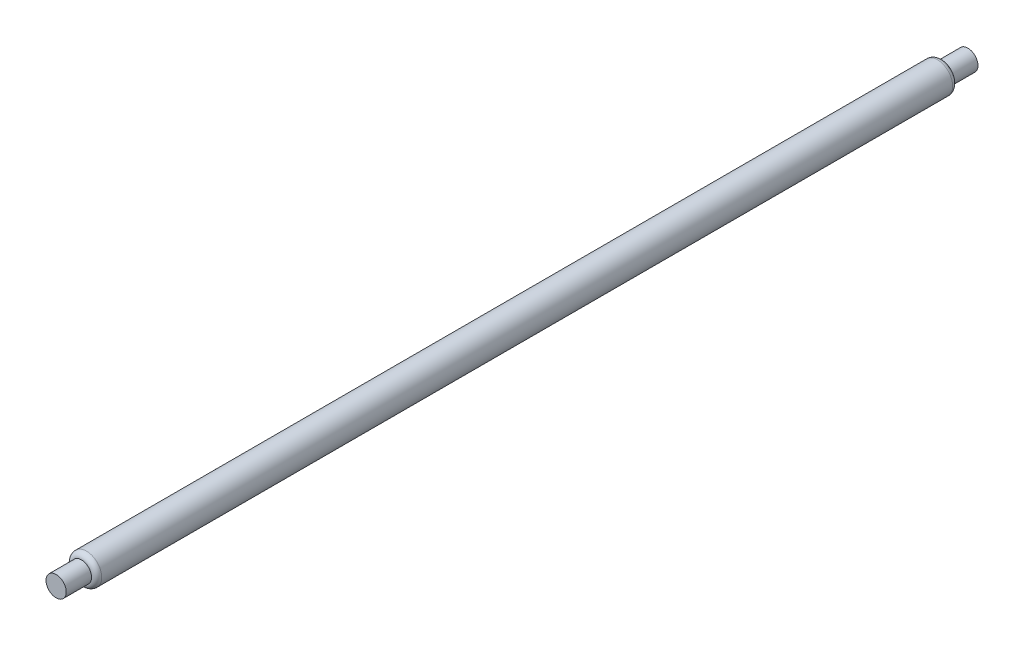
ISO-10303-21;
HEADER;
FILE_DESCRIPTION(('STEP AP214'),'2;1');
FILE_NAME('part.step','',(''),(''),'','','');
FILE_SCHEMA(('AUTOMOTIVE_DESIGN { 1 0 10303 214 1 1 1 1 }'));
ENDSEC;
DATA;
#1=APPLICATION_CONTEXT('core data for automotive mechanical design processes');
#2=APPLICATION_PROTOCOL_DEFINITION('international standard','automotive_design',2000,#1);
#3=PRODUCT_CONTEXT('',#1,'mechanical');
#4=PRODUCT('Part','Part','',(#3));
#5=PRODUCT_RELATED_PRODUCT_CATEGORY('part','',(#4));
#6=PRODUCT_DEFINITION_FORMATION('','',#4);
#7=PRODUCT_DEFINITION_CONTEXT('part definition',#1,'design');
#8=PRODUCT_DEFINITION('design','',#6,#7);
#9=PRODUCT_DEFINITION_SHAPE('','',#8);
#10=(LENGTH_UNIT() NAMED_UNIT(*) SI_UNIT(.MILLI.,.METRE.));
#11=(NAMED_UNIT(*) PLANE_ANGLE_UNIT() SI_UNIT($,.RADIAN.));
#12=(NAMED_UNIT(*) SI_UNIT($,.STERADIAN.) SOLID_ANGLE_UNIT());
#13=UNCERTAINTY_MEASURE_WITH_UNIT(LENGTH_MEASURE(1.E-05),#10,'distance_accuracy_value','');
#14=(GEOMETRIC_REPRESENTATION_CONTEXT(3) GLOBAL_UNCERTAINTY_ASSIGNED_CONTEXT((#13)) GLOBAL_UNIT_ASSIGNED_CONTEXT((#10,
#11,#12)) REPRESENTATION_CONTEXT('',''));
#15=CARTESIAN_POINT('',(0.,0.,0.));
#16=DIRECTION('',(0.,0.,1.));
#17=DIRECTION('',(1.,0.,0.));
#18=AXIS2_PLACEMENT_3D('',#15,#16,#17);
#19=CARTESIAN_POINT('',(0.,0.,180.));
#20=DIRECTION('',(0.,0.,-1.));
#21=DIRECTION('',(-1.,0.,0.));
#22=AXIS2_PLACEMENT_3D('',#19,#20,#21);
#23=CYLINDRICAL_SURFACE('',#22,6.);
#24=CARTESIAN_POINT('',(0.,0.,-168.));
#25=DIRECTION('',(0.,0.,-1.));
#26=DIRECTION('',(-1.,0.,0.));
#27=AXIS2_PLACEMENT_3D('',#24,#25,#26);
#28=CIRCLE('',#27,6.);
#29=CARTESIAN_POINT('',(-6.,0.,-168.));
#30=VERTEX_POINT('',#29);
#31=EDGE_CURVE('E10',#30,#30,#28,.F.);
#32=CARTESIAN_POINT('',(0.,0.,168.));
#33=DIRECTION('',(0.,0.,1.));
#34=DIRECTION('',(1.,0.,0.));
#35=AXIS2_PLACEMENT_3D('',#32,#33,#34);
#36=CIRCLE('',#35,6.);
#37=CARTESIAN_POINT('',(-6.,0.,168.));
#38=VERTEX_POINT('',#37);
#39=EDGE_CURVE('E39',#38,#38,#36,.F.);
#40=CARTESIAN_POINT('',(-6.,0.,-168.));
#41=CARTESIAN_POINT('',(-6.,0.,-164.5));
#42=CARTESIAN_POINT('',(-6.,0.,-161.));
#43=CARTESIAN_POINT('',(-6.,0.,-154.));
#44=CARTESIAN_POINT('',(-6.,0.,-150.5));
#45=CARTESIAN_POINT('',(-6.,0.,-143.5));
#46=CARTESIAN_POINT('',(-6.,0.,-140.));
#47=CARTESIAN_POINT('',(-6.,0.,-133.));
#48=CARTESIAN_POINT('',(-6.,0.,-129.5));
#49=CARTESIAN_POINT('',(-6.,0.,-122.5));
#50=CARTESIAN_POINT('',(-6.,0.,-119.));
#51=CARTESIAN_POINT('',(-6.,0.,-112.));
#52=CARTESIAN_POINT('',(-6.,0.,-108.5));
#53=CARTESIAN_POINT('',(-6.,0.,-101.5));
#54=CARTESIAN_POINT('',(-6.,0.,-98.));
#55=CARTESIAN_POINT('',(-6.,0.,-91.));
#56=CARTESIAN_POINT('',(-6.,0.,-87.5));
#57=CARTESIAN_POINT('',(-6.,0.,-80.5));
#58=CARTESIAN_POINT('',(-6.,0.,-77.));
#59=CARTESIAN_POINT('',(-6.,0.,-70.));
#60=CARTESIAN_POINT('',(-6.,0.,-66.5));
#61=CARTESIAN_POINT('',(-6.,0.,-59.5));
#62=CARTESIAN_POINT('',(-6.,0.,-56.));
#63=CARTESIAN_POINT('',(-6.,0.,-49.));
#64=CARTESIAN_POINT('',(-6.,0.,-45.5));
#65=CARTESIAN_POINT('',(-6.,0.,-38.5));
#66=CARTESIAN_POINT('',(-6.,0.,-35.));
#67=CARTESIAN_POINT('',(-6.,0.,-28.));
#68=CARTESIAN_POINT('',(-6.,0.,-24.5));
#69=CARTESIAN_POINT('',(-6.,0.,-17.5));
#70=CARTESIAN_POINT('',(-6.,0.,-14.));
#71=CARTESIAN_POINT('',(-6.,0.,-7.00000000000003));
#72=CARTESIAN_POINT('',(-6.,0.,-3.50000000000003));
#73=CARTESIAN_POINT('',(-6.,0.,3.49999999999998));
#74=CARTESIAN_POINT('',(-6.,0.,6.99999999999998));
#75=CARTESIAN_POINT('',(-6.,0.,14.));
#76=CARTESIAN_POINT('',(-6.,0.,17.5));
#77=CARTESIAN_POINT('',(-6.,0.,24.5));
#78=CARTESIAN_POINT('',(-6.,0.,28.));
#79=CARTESIAN_POINT('',(-6.,0.,35.));
#80=CARTESIAN_POINT('',(-6.,0.,38.5));
#81=CARTESIAN_POINT('',(-6.,0.,45.5));
#82=CARTESIAN_POINT('',(-6.,0.,49.));
#83=CARTESIAN_POINT('',(-6.,0.,56.));
#84=CARTESIAN_POINT('',(-6.,0.,59.5));
#85=CARTESIAN_POINT('',(-6.,0.,66.5));
#86=CARTESIAN_POINT('',(-6.,0.,70.));
#87=CARTESIAN_POINT('',(-6.,0.,77.));
#88=CARTESIAN_POINT('',(-6.,0.,80.5));
#89=CARTESIAN_POINT('',(-6.,0.,87.5));
#90=CARTESIAN_POINT('',(-6.,0.,91.));
#91=CARTESIAN_POINT('',(-6.,0.,98.));
#92=CARTESIAN_POINT('',(-6.,0.,101.5));
#93=CARTESIAN_POINT('',(-6.,0.,108.5));
#94=CARTESIAN_POINT('',(-6.,0.,112.));
#95=CARTESIAN_POINT('',(-6.,0.,119.));
#96=CARTESIAN_POINT('',(-6.,0.,122.5));
#97=CARTESIAN_POINT('',(-6.,0.,129.5));
#98=CARTESIAN_POINT('',(-6.,0.,133.));
#99=CARTESIAN_POINT('',(-6.,0.,140.));
#100=CARTESIAN_POINT('',(-6.,0.,143.5));
#101=CARTESIAN_POINT('',(-6.,0.,150.5));
#102=CARTESIAN_POINT('',(-6.,0.,154.));
#103=CARTESIAN_POINT('',(-6.,0.,161.));
#104=CARTESIAN_POINT('',(-6.,0.,164.5));
#105=CARTESIAN_POINT('',(-6.,0.,168.));
#106=B_SPLINE_CURVE_WITH_KNOTS('',3,(#40,#41,#42,#43,#44,#45,#46,#47,#48,#49,#50,#51,#52,#53,
#54,#55,#56,#57,#58,#59,#60,#61,#62,#63,#64,#65,#66,#67,#68,#69,#70,#71,#72,#73,#74,#75,#76,#77,
#78,#79,#80,#81,#82,#83,#84,#85,#86,#87,#88,#89,#90,#91,#92,#93,#94,#95,#96,#97,#98,#99,#100,
#101,#102,#103,#104,#105),.UNSPECIFIED.,.F.,.F.,(4,2,2,2,2,2,2,2,2,2,2,2,2,2,2,2,2,2,2,2,2,2,2,
2,2,2,2,2,2,2,2,2,4),(0.,10.5,21.,31.5,42.,52.5,63.,73.5,84.,94.5,105.,115.5,126.,136.5,147.,
157.5,168.,178.5,189.,199.5,210.,220.5,231.,241.5,252.,262.5,273.,283.5,294.,304.5,315.,325.5,
336.),.UNSPECIFIED.);
#107=EDGE_CURVE('BSEAM32',#30,#38,#106,.T.);
#108=ORIENTED_EDGE('',*,*,#31,.T.);
#109=ORIENTED_EDGE('',*,*,#39,.T.);
#110=ORIENTED_EDGE('',*,*,#107,.T.);
#111=ORIENTED_EDGE('',*,*,#107,.F.);
#112=EDGE_LOOP('',(#108,#110,#109,#111));
#113=FACE_BOUND('',#112,.T.);
#114=ADVANCED_FACE('F32',(#113),#23,.T.);
#115=CARTESIAN_POINT('',(0.,0.,170.));
#116=DIRECTION('',(0.,0.,1.));
#117=DIRECTION('',(1.,0.,0.));
#118=AXIS2_PLACEMENT_3D('',#115,#116,#117);
#119=CYLINDRICAL_SURFACE('',#118,4.);
#120=CARTESIAN_POINT('',(0.,0.,170.));
#121=DIRECTION('',(0.,0.,1.));
#122=DIRECTION('',(1.,0.,0.));
#123=AXIS2_PLACEMENT_3D('',#120,#121,#122);
#124=CIRCLE('',#123,4.);
#125=CARTESIAN_POINT('',(4.,0.,170.));
#126=VERTEX_POINT('',#125);
#127=EDGE_CURVE('E43',#126,#126,#124,.T.);
#128=ORIENTED_EDGE('',*,*,#127,.T.);
#129=EDGE_LOOP('',(#128));
#130=FACE_BOUND('',#129,.T.);
#131=CARTESIAN_POINT('',(0.,0.,180.));
#132=DIRECTION('',(0.,0.,1.));
#133=DIRECTION('',(1.,0.,0.));
#134=AXIS2_PLACEMENT_3D('',#131,#132,#133);
#135=CIRCLE('',#134,4.);
#136=CARTESIAN_POINT('',(4.,0.,180.));
#137=VERTEX_POINT('',#136);
#138=EDGE_CURVE('E47',#137,#137,#135,.T.);
#139=ORIENTED_EDGE('',*,*,#138,.F.);
#140=EDGE_LOOP('',(#139));
#141=FACE_BOUND('',#140,.T.);
#142=ADVANCED_FACE('F77',(#130,#141),#119,.T.);
#143=CARTESIAN_POINT('',(0.,0.,180.));
#144=DIRECTION('',(0.,0.,1.));
#145=DIRECTION('',(1.,0.,0.));
#146=AXIS2_PLACEMENT_3D('',#143,#144,#145);
#147=PLANE('',#146);
#148=ORIENTED_EDGE('',*,*,#138,.T.);
#149=EDGE_LOOP('',(#148));
#150=FACE_BOUND('',#149,.T.);
#151=ADVANCED_FACE('F81',(#150),#147,.T.);
#152=CARTESIAN_POINT('',(0.,0.,168.));
#153=DIRECTION('',(0.,0.,1.));
#154=DIRECTION('',(1.,0.,0.));
#155=AXIS2_PLACEMENT_3D('',#152,#153,#154);
#156=TOROIDAL_SURFACE('',#155,4.,2.);
#157=ORIENTED_EDGE('',*,*,#39,.F.);
#158=EDGE_LOOP('',(#157));
#159=FACE_BOUND('',#158,.T.);
#160=ORIENTED_EDGE('',*,*,#127,.F.);
#161=EDGE_LOOP('',(#160));
#162=FACE_BOUND('',#161,.T.);
#163=ADVANCED_FACE('F65',(#159,#162),#156,.T.);
#164=CARTESIAN_POINT('',(0.,0.,-170.));
#165=DIRECTION('',(0.,0.,-1.));
#166=DIRECTION('',(-1.,0.,0.));
#167=AXIS2_PLACEMENT_3D('',#164,#165,#166);
#168=CYLINDRICAL_SURFACE('',#167,4.);
#169=CARTESIAN_POINT('',(0.,0.,-170.));
#170=DIRECTION('',(0.,0.,1.));
#171=DIRECTION('',(1.,0.,0.));
#172=AXIS2_PLACEMENT_3D('',#169,#170,#171);
#173=CIRCLE('',#172,4.);
#174=CARTESIAN_POINT('',(4.,0.,-170.));
#175=VERTEX_POINT('',#174);
#176=EDGE_CURVE('E51',#175,#175,#173,.T.);
#177=ORIENTED_EDGE('',*,*,#176,.F.);
#178=EDGE_LOOP('',(#177));
#179=FACE_BOUND('',#178,.T.);
#180=CARTESIAN_POINT('',(0.,0.,-180.));
#181=DIRECTION('',(0.,0.,1.));
#182=DIRECTION('',(1.,0.,0.));
#183=AXIS2_PLACEMENT_3D('',#180,#181,#182);
#184=CIRCLE('',#183,4.);
#185=CARTESIAN_POINT('',(4.,0.,-180.));
#186=VERTEX_POINT('',#185);
#187=EDGE_CURVE('E53',#186,#186,#184,.T.);
#188=ORIENTED_EDGE('',*,*,#187,.T.);
#189=EDGE_LOOP('',(#188));
#190=FACE_BOUND('',#189,.T.);
#191=ADVANCED_FACE('F61',(#179,#190),#168,.T.);
#192=CARTESIAN_POINT('',(0.,0.,-180.));
#193=DIRECTION('',(0.,0.,1.));
#194=DIRECTION('',(1.,0.,0.));
#195=AXIS2_PLACEMENT_3D('',#192,#193,#194);
#196=PLANE('',#195);
#197=ORIENTED_EDGE('',*,*,#187,.F.);
#198=EDGE_LOOP('',(#197));
#199=FACE_BOUND('',#198,.T.);
#200=ADVANCED_FACE('F64',(#199),#196,.F.);
#201=CARTESIAN_POINT('',(0.,0.,-168.));
#202=DIRECTION('',(0.,0.,-1.));
#203=DIRECTION('',(-1.,0.,0.));
#204=AXIS2_PLACEMENT_3D('',#201,#202,#203);
#205=TOROIDAL_SURFACE('',#204,4.,2.);
#206=ORIENTED_EDGE('',*,*,#176,.T.);
#207=EDGE_LOOP('',(#206));
#208=FACE_BOUND('',#207,.T.);
#209=ORIENTED_EDGE('',*,*,#31,.F.);
#210=EDGE_LOOP('',(#209));
#211=FACE_BOUND('',#210,.T.);
#212=ADVANCED_FACE('F34',(#208,#211),#205,.T.);
#213=CLOSED_SHELL('',(#114,#142,#151,#163,#191,#200,#212));
#214=MANIFOLD_SOLID_BREP('B2',#213);
#215=ADVANCED_BREP_SHAPE_REPRESENTATION('',(#18,#214),#14);
#216=SHAPE_DEFINITION_REPRESENTATION(#9,#215);
ENDSEC;
END-ISO-10303-21;
